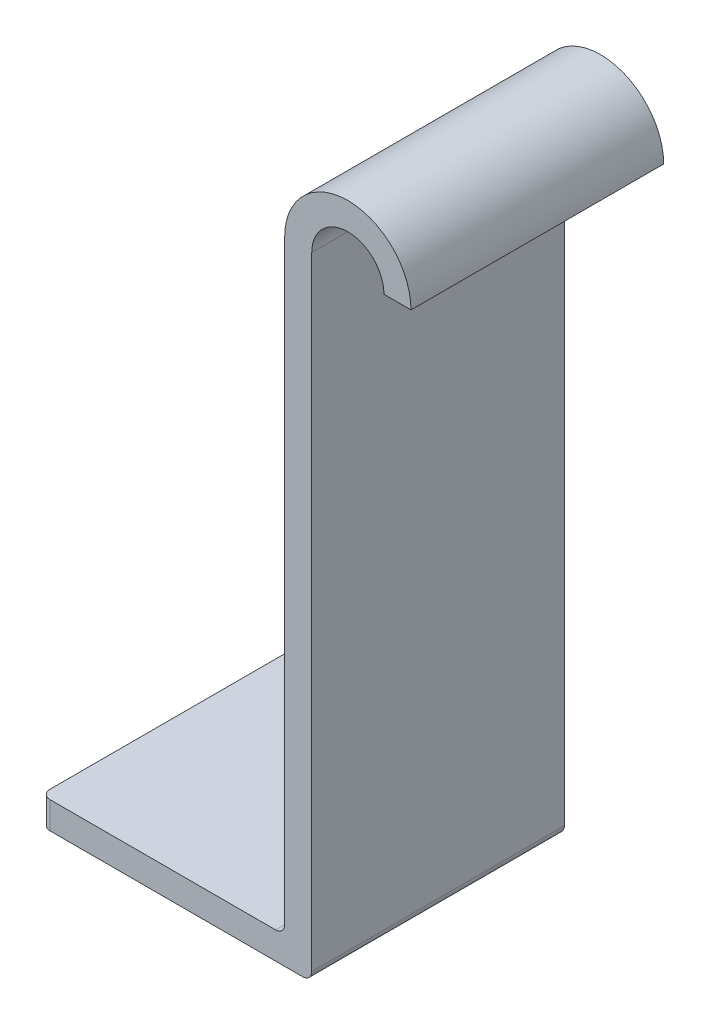
ISO-10303-21;
HEADER;
FILE_DESCRIPTION(('STEP AP214'),'2;1');
FILE_NAME('part.step','',(''),(''),'','','');
FILE_SCHEMA(('AUTOMOTIVE_DESIGN { 1 0 10303 214 1 1 1 1 }'));
ENDSEC;
DATA;
#1=APPLICATION_CONTEXT('core data for automotive mechanical design processes');
#2=APPLICATION_PROTOCOL_DEFINITION('international standard','automotive_design',2000,#1);
#3=PRODUCT_CONTEXT('',#1,'mechanical');
#4=PRODUCT('Part','Part','',(#3));
#5=PRODUCT_RELATED_PRODUCT_CATEGORY('part','',(#4));
#6=PRODUCT_DEFINITION_FORMATION('','',#4);
#7=PRODUCT_DEFINITION_CONTEXT('part definition',#1,'design');
#8=PRODUCT_DEFINITION('design','',#6,#7);
#9=PRODUCT_DEFINITION_SHAPE('','',#8);
#10=(LENGTH_UNIT() NAMED_UNIT(*) SI_UNIT(.MILLI.,.METRE.));
#11=(NAMED_UNIT(*) PLANE_ANGLE_UNIT() SI_UNIT($,.RADIAN.));
#12=(NAMED_UNIT(*) SI_UNIT($,.STERADIAN.) SOLID_ANGLE_UNIT());
#13=UNCERTAINTY_MEASURE_WITH_UNIT(LENGTH_MEASURE(1.E-05),#10,'distance_accuracy_value','');
#14=(GEOMETRIC_REPRESENTATION_CONTEXT(3) GLOBAL_UNCERTAINTY_ASSIGNED_CONTEXT((#13)) GLOBAL_UNIT_ASSIGNED_CONTEXT((#10,
#11,#12)) REPRESENTATION_CONTEXT('',''));
#15=CARTESIAN_POINT('',(0.,0.,0.));
#16=DIRECTION('',(0.,0.,1.));
#17=DIRECTION('',(1.,0.,0.));
#18=AXIS2_PLACEMENT_3D('',#15,#16,#17);
#19=CARTESIAN_POINT('',(4.,0.,28.));
#20=DIRECTION('',(0.,0.,-1.));
#21=DIRECTION('',(-1.,0.,0.));
#22=AXIS2_PLACEMENT_3D('',#19,#20,#21);
#23=CYLINDRICAL_SURFACE('',#22,4.);
#24=CARTESIAN_POINT('',(4.,0.,0.));
#25=DIRECTION('',(0.,0.,-1.));
#26=DIRECTION('',(-1.,0.,0.));
#27=AXIS2_PLACEMENT_3D('',#24,#25,#26);
#28=CIRCLE('',#27,4.);
#29=CARTESIAN_POINT('',(0.,0.,0.));
#30=VERTEX_POINT('',#29);
#31=CARTESIAN_POINT('',(8.,0.,0.));
#32=VERTEX_POINT('',#31);
#33=EDGE_CURVE('E150',#30,#32,#28,.T.);
#34=ORIENTED_EDGE('',*,*,#33,.T.);
#35=DIRECTION('',(0.,0.,-1.));
#36=VECTOR('',#35,1.);
#37=CARTESIAN_POINT('',(8.,0.,28.));
#38=LINE('',#37,#36);
#39=CARTESIAN_POINT('',(8.,0.,28.));
#40=VERTEX_POINT('',#39);
#41=EDGE_CURVE('E132',#40,#32,#38,.T.);
#42=ORIENTED_EDGE('',*,*,#41,.F.);
#43=CARTESIAN_POINT('',(4.,0.,28.));
#44=DIRECTION('',(0.,0.,-1.));
#45=DIRECTION('',(-1.,0.,0.));
#46=AXIS2_PLACEMENT_3D('',#43,#44,#45);
#47=CIRCLE('',#46,4.);
#48=CARTESIAN_POINT('',(0.,0.,28.));
#49=VERTEX_POINT('',#48);
#50=EDGE_CURVE('E138',#49,#40,#47,.T.);
#51=ORIENTED_EDGE('',*,*,#50,.F.);
#52=DIRECTION('',(0.,0.,-1.));
#53=VECTOR('',#52,1.);
#54=CARTESIAN_POINT('',(0.,0.,28.));
#55=LINE('',#54,#53);
#56=EDGE_CURVE('E217',#49,#30,#55,.T.);
#57=ORIENTED_EDGE('',*,*,#56,.T.);
#58=EDGE_LOOP('',(#34,#42,#51,#57));
#59=FACE_BOUND('',#58,.T.);
#60=ADVANCED_FACE('F37',(#59),#23,.F.);
#61=CARTESIAN_POINT('',(8.,0.,28.));
#62=DIRECTION('',(0.,1.,0.));
#63=DIRECTION('',(-1.,0.,0.));
#64=AXIS2_PLACEMENT_3D('',#61,#62,#63);
#65=PLANE('',#64);
#66=DIRECTION('',(1.,0.,0.));
#67=VECTOR('',#66,1.);
#68=CARTESIAN_POINT('',(8.,0.,0.));
#69=LINE('',#68,#67);
#70=CARTESIAN_POINT('',(11.,0.,0.));
#71=VERTEX_POINT('',#70);
#72=EDGE_CURVE('E219',#32,#71,#69,.T.);
#73=ORIENTED_EDGE('',*,*,#72,.T.);
#74=DIRECTION('',(0.,0.,-1.));
#75=VECTOR('',#74,1.);
#76=CARTESIAN_POINT('',(11.,0.,28.));
#77=LINE('',#76,#75);
#78=CARTESIAN_POINT('',(11.,0.,28.));
#79=VERTEX_POINT('',#78);
#80=EDGE_CURVE('E135',#79,#71,#77,.T.);
#81=ORIENTED_EDGE('',*,*,#80,.F.);
#82=DIRECTION('',(1.,0.,0.));
#83=VECTOR('',#82,1.);
#84=CARTESIAN_POINT('',(8.,0.,28.));
#85=LINE('',#84,#83);
#86=EDGE_CURVE('E128',#40,#79,#85,.T.);
#87=ORIENTED_EDGE('',*,*,#86,.F.);
#88=ORIENTED_EDGE('',*,*,#41,.T.);
#89=EDGE_LOOP('',(#73,#81,#87,#88));
#90=FACE_BOUND('',#89,.T.);
#91=ADVANCED_FACE('F130',(#90),#65,.F.);
#92=CARTESIAN_POINT('',(4.,0.,28.));
#93=DIRECTION('',(0.,0.,-1.));
#94=DIRECTION('',(-1.,0.,0.));
#95=AXIS2_PLACEMENT_3D('',#92,#93,#94);
#96=CYLINDRICAL_SURFACE('',#95,7.);
#97=CARTESIAN_POINT('',(4.,0.,0.));
#98=DIRECTION('',(0.,0.,1.));
#99=DIRECTION('',(-1.,0.,0.));
#100=AXIS2_PLACEMENT_3D('',#97,#98,#99);
#101=CIRCLE('',#100,7.);
#102=CARTESIAN_POINT('',(-3.,0.,0.));
#103=VERTEX_POINT('',#102);
#104=EDGE_CURVE('E199',#71,#103,#101,.T.);
#105=ORIENTED_EDGE('',*,*,#104,.T.);
#106=DIRECTION('',(0.,0.,-1.));
#107=VECTOR('',#106,1.);
#108=CARTESIAN_POINT('',(-3.,0.,28.));
#109=LINE('',#108,#107);
#110=CARTESIAN_POINT('',(-3.,0.,28.));
#111=VERTEX_POINT('',#110);
#112=EDGE_CURVE('E155',#111,#103,#109,.T.);
#113=ORIENTED_EDGE('',*,*,#112,.F.);
#114=CARTESIAN_POINT('',(4.,0.,28.));
#115=DIRECTION('',(0.,0.,1.));
#116=DIRECTION('',(-1.,0.,0.));
#117=AXIS2_PLACEMENT_3D('',#114,#115,#116);
#118=CIRCLE('',#117,7.);
#119=EDGE_CURVE('E137',#79,#111,#118,.T.);
#120=ORIENTED_EDGE('',*,*,#119,.F.);
#121=ORIENTED_EDGE('',*,*,#80,.T.);
#122=EDGE_LOOP('',(#105,#113,#120,#121));
#123=FACE_BOUND('',#122,.T.);
#124=ADVANCED_FACE('F252',(#123),#96,.T.);
#125=CARTESIAN_POINT('',(-3.,0.,28.));
#126=DIRECTION('',(1.,0.,0.));
#127=DIRECTION('',(0.,1.,0.));
#128=AXIS2_PLACEMENT_3D('',#125,#126,#127);
#129=PLANE('',#128);
#130=DIRECTION('',(0.,-1.,0.));
#131=VECTOR('',#130,1.);
#132=CARTESIAN_POINT('',(-3.,0.,0.));
#133=LINE('',#132,#131);
#134=CARTESIAN_POINT('',(-2.99999999999999,-66.,0.));
#135=VERTEX_POINT('',#134);
#136=EDGE_CURVE('E191',#103,#135,#133,.T.);
#137=ORIENTED_EDGE('',*,*,#136,.T.);
#138=DIRECTION('',(0.,0.,-1.));
#139=VECTOR('',#138,1.);
#140=CARTESIAN_POINT('',(-2.99999999999999,-66.,28.));
#141=LINE('',#140,#139);
#142=CARTESIAN_POINT('',(-2.99999999999999,-66.,28.));
#143=VERTEX_POINT('',#142);
#144=EDGE_CURVE('E60',#135,#143,#141,.F.);
#145=ORIENTED_EDGE('',*,*,#144,.T.);
#146=DIRECTION('',(0.,-1.,0.));
#147=VECTOR('',#146,1.);
#148=CARTESIAN_POINT('',(-3.,0.,28.));
#149=LINE('',#148,#147);
#150=EDGE_CURVE('E205',#111,#143,#149,.T.);
#151=ORIENTED_EDGE('',*,*,#150,.F.);
#152=ORIENTED_EDGE('',*,*,#112,.T.);
#153=EDGE_LOOP('',(#137,#145,#151,#152));
#154=FACE_BOUND('',#153,.T.);
#155=ADVANCED_FACE('F197',(#154),#129,.F.);
#156=CARTESIAN_POINT('',(-2.99999999999999,-67.,28.));
#157=DIRECTION('',(0.,-1.,0.));
#158=DIRECTION('',(0.,0.,-1.));
#159=AXIS2_PLACEMENT_3D('',#156,#157,#158);
#160=PLANE('',#159);
#161=DIRECTION('',(-1.,0.,0.));
#162=VECTOR('',#161,1.);
#163=CARTESIAN_POINT('',(-2.99999999999999,-67.,0.));
#164=LINE('',#163,#162);
#165=CARTESIAN_POINT('',(-3.99999999999999,-67.,0.));
#166=VERTEX_POINT('',#165);
#167=CARTESIAN_POINT('',(-29.,-67.,0.));
#168=VERTEX_POINT('',#167);
#169=EDGE_CURVE('E193',#166,#168,#164,.T.);
#170=ORIENTED_EDGE('',*,*,#169,.T.);
#171=CARTESIAN_POINT('',(-29.,-67.,1.));
#172=DIRECTION('',(0.,-1.,0.));
#173=DIRECTION('',(0.,0.,-1.));
#174=AXIS2_PLACEMENT_3D('',#171,#172,#173);
#175=CIRCLE('',#174,1.);
#176=CARTESIAN_POINT('',(-30.,-67.,1.));
#177=VERTEX_POINT('',#176);
#178=EDGE_CURVE('E176',#168,#177,#175,.F.);
#179=ORIENTED_EDGE('',*,*,#178,.T.);
#180=DIRECTION('',(0.,0.,-1.));
#181=VECTOR('',#180,1.);
#182=CARTESIAN_POINT('',(-30.,-67.,28.));
#183=LINE('',#182,#181);
#184=CARTESIAN_POINT('',(-30.,-67.,27.));
#185=VERTEX_POINT('',#184);
#186=EDGE_CURVE('E231',#185,#177,#183,.T.);
#187=ORIENTED_EDGE('',*,*,#186,.F.);
#188=CARTESIAN_POINT('',(-29.,-67.,27.));
#189=DIRECTION('',(0.,-1.,0.));
#190=DIRECTION('',(0.,0.,-1.));
#191=AXIS2_PLACEMENT_3D('',#188,#189,#190);
#192=CIRCLE('',#191,1.);
#193=CARTESIAN_POINT('',(-29.,-67.,28.));
#194=VERTEX_POINT('',#193);
#195=EDGE_CURVE('E174',#185,#194,#192,.F.);
#196=ORIENTED_EDGE('',*,*,#195,.T.);
#197=DIRECTION('',(-1.,0.,0.));
#198=VECTOR('',#197,1.);
#199=CARTESIAN_POINT('',(-2.99999999999999,-67.,28.));
#200=LINE('',#199,#198);
#201=CARTESIAN_POINT('',(-3.99999999999999,-67.,28.));
#202=VERTEX_POINT('',#201);
#203=EDGE_CURVE('E203',#202,#194,#200,.T.);
#204=ORIENTED_EDGE('',*,*,#203,.F.);
#205=DIRECTION('',(0.,0.,-1.));
#206=VECTOR('',#205,1.);
#207=CARTESIAN_POINT('',(-3.99999999999999,-67.,0.));
#208=LINE('',#207,#206);
#209=EDGE_CURVE('E171',#202,#166,#208,.T.);
#210=ORIENTED_EDGE('',*,*,#209,.T.);
#211=EDGE_LOOP('',(#170,#179,#187,#196,#204,#210));
#212=FACE_BOUND('',#211,.T.);
#213=ADVANCED_FACE('F207',(#212),#160,.F.);
#214=CARTESIAN_POINT('',(-30.,-70.,28.));
#215=DIRECTION('',(1.,0.,0.));
#216=DIRECTION('',(0.,0.,-1.));
#217=AXIS2_PLACEMENT_3D('',#214,#215,#216);
#218=PLANE('',#217);
#219=ORIENTED_EDGE('',*,*,#186,.T.);
#220=DIRECTION('',(0.,-1.,0.));
#221=VECTOR('',#220,1.);
#222=CARTESIAN_POINT('',(-30.,-70.,1.));
#223=LINE('',#222,#221);
#224=CARTESIAN_POINT('',(-30.,-70.,1.));
#225=VERTEX_POINT('',#224);
#226=EDGE_CURVE('E153',#177,#225,#223,.T.);
#227=ORIENTED_EDGE('',*,*,#226,.T.);
#228=DIRECTION('',(0.,0.,-1.));
#229=VECTOR('',#228,1.);
#230=CARTESIAN_POINT('',(-30.,-70.,28.));
#231=LINE('',#230,#229);
#232=CARTESIAN_POINT('',(-30.,-70.,27.));
#233=VERTEX_POINT('',#232);
#234=EDGE_CURVE('E228',#233,#225,#231,.T.);
#235=ORIENTED_EDGE('',*,*,#234,.F.);
#236=DIRECTION('',(0.,-1.,0.));
#237=VECTOR('',#236,1.);
#238=CARTESIAN_POINT('',(-30.,-70.,27.));
#239=LINE('',#238,#237);
#240=EDGE_CURVE('E151',#233,#185,#239,.F.);
#241=ORIENTED_EDGE('',*,*,#240,.T.);
#242=EDGE_LOOP('',(#219,#227,#235,#241));
#243=FACE_BOUND('',#242,.T.);
#244=ADVANCED_FACE('F235',(#243),#218,.F.);
#245=CARTESIAN_POINT('',(0.,-70.,28.));
#246=DIRECTION('',(0.,1.,0.));
#247=DIRECTION('',(0.,0.,1.));
#248=AXIS2_PLACEMENT_3D('',#245,#246,#247);
#249=PLANE('',#248);
#250=ORIENTED_EDGE('',*,*,#234,.T.);
#251=CARTESIAN_POINT('',(-29.,-70.,1.));
#252=DIRECTION('',(0.,1.,0.));
#253=DIRECTION('',(0.,0.,1.));
#254=AXIS2_PLACEMENT_3D('',#251,#252,#253);
#255=CIRCLE('',#254,1.);
#256=CARTESIAN_POINT('',(-29.,-70.,0.));
#257=VERTEX_POINT('',#256);
#258=EDGE_CURVE('E165',#225,#257,#255,.F.);
#259=ORIENTED_EDGE('',*,*,#258,.T.);
#260=DIRECTION('',(1.,0.,0.));
#261=VECTOR('',#260,1.);
#262=CARTESIAN_POINT('',(0.,-70.,0.));
#263=LINE('',#262,#261);
#264=CARTESIAN_POINT('',(-0.999999999999992,-70.,0.));
#265=VERTEX_POINT('',#264);
#266=EDGE_CURVE('E223',#257,#265,#263,.T.);
#267=ORIENTED_EDGE('',*,*,#266,.T.);
#268=DIRECTION('',(0.,0.,-1.));
#269=VECTOR('',#268,1.);
#270=CARTESIAN_POINT('',(-0.999999999999992,-70.,28.));
#271=LINE('',#270,#269);
#272=CARTESIAN_POINT('',(-0.999999999999992,-70.,28.));
#273=VERTEX_POINT('',#272);
#274=EDGE_CURVE('E161',#265,#273,#271,.F.);
#275=ORIENTED_EDGE('',*,*,#274,.T.);
#276=DIRECTION('',(1.,0.,0.));
#277=VECTOR('',#276,1.);
#278=CARTESIAN_POINT('',(0.,-70.,28.));
#279=LINE('',#278,#277);
#280=CARTESIAN_POINT('',(-29.,-70.,28.));
#281=VERTEX_POINT('',#280);
#282=EDGE_CURVE('E210',#281,#273,#279,.T.);
#283=ORIENTED_EDGE('',*,*,#282,.F.);
#284=CARTESIAN_POINT('',(-29.,-70.,27.));
#285=DIRECTION('',(0.,1.,0.));
#286=DIRECTION('',(0.,0.,1.));
#287=AXIS2_PLACEMENT_3D('',#284,#285,#286);
#288=CIRCLE('',#287,1.);
#289=EDGE_CURVE('E163',#281,#233,#288,.F.);
#290=ORIENTED_EDGE('',*,*,#289,.T.);
#291=EDGE_LOOP('',(#250,#259,#267,#275,#283,#290));
#292=FACE_BOUND('',#291,.T.);
#293=ADVANCED_FACE('F243',(#292),#249,.F.);
#294=CARTESIAN_POINT('',(0.,0.,28.));
#295=DIRECTION('',(-1.,0.,0.));
#296=DIRECTION('',(0.,-1.,0.));
#297=AXIS2_PLACEMENT_3D('',#294,#295,#296);
#298=PLANE('',#297);
#299=DIRECTION('',(0.,1.,0.));
#300=VECTOR('',#299,1.);
#301=CARTESIAN_POINT('',(0.,0.,28.));
#302=LINE('',#301,#300);
#303=CARTESIAN_POINT('',(0.,-69.,28.));
#304=VERTEX_POINT('',#303);
#305=EDGE_CURVE('E143',#304,#49,#302,.T.);
#306=ORIENTED_EDGE('',*,*,#305,.F.);
#307=DIRECTION('',(0.,0.,-1.));
#308=VECTOR('',#307,1.);
#309=CARTESIAN_POINT('',(0.,-69.,28.));
#310=LINE('',#309,#308);
#311=CARTESIAN_POINT('',(0.,-69.,0.));
#312=VERTEX_POINT('',#311);
#313=EDGE_CURVE('E182',#304,#312,#310,.T.);
#314=ORIENTED_EDGE('',*,*,#313,.T.);
#315=DIRECTION('',(0.,1.,0.));
#316=VECTOR('',#315,1.);
#317=CARTESIAN_POINT('',(0.,0.,0.));
#318=LINE('',#317,#316);
#319=EDGE_CURVE('E147',#312,#30,#318,.T.);
#320=ORIENTED_EDGE('',*,*,#319,.T.);
#321=ORIENTED_EDGE('',*,*,#56,.F.);
#322=EDGE_LOOP('',(#306,#314,#320,#321));
#323=FACE_BOUND('',#322,.T.);
#324=ADVANCED_FACE('F250',(#323),#298,.F.);
#325=CARTESIAN_POINT('',(4.,0.,28.));
#326=DIRECTION('',(0.,0.,-1.));
#327=DIRECTION('',(-1.,0.,0.));
#328=AXIS2_PLACEMENT_3D('',#325,#326,#327);
#329=PLANE('',#328);
#330=ORIENTED_EDGE('',*,*,#203,.T.);
#331=DIRECTION('',(0.,-1.,0.));
#332=VECTOR('',#331,1.);
#333=CARTESIAN_POINT('',(-29.,0.,28.));
#334=LINE('',#333,#332);
#335=EDGE_CURVE('E179',#194,#281,#334,.T.);
#336=ORIENTED_EDGE('',*,*,#335,.T.);
#337=ORIENTED_EDGE('',*,*,#282,.T.);
#338=CARTESIAN_POINT('',(-0.999999999999992,-69.,28.));
#339=DIRECTION('',(0.,0.,-1.));
#340=DIRECTION('',(-1.,0.,0.));
#341=AXIS2_PLACEMENT_3D('',#338,#339,#340);
#342=CIRCLE('',#341,1.);
#343=EDGE_CURVE('E52',#273,#304,#342,.F.);
#344=ORIENTED_EDGE('',*,*,#343,.T.);
#345=ORIENTED_EDGE('',*,*,#305,.T.);
#346=ORIENTED_EDGE('',*,*,#50,.T.);
#347=ORIENTED_EDGE('',*,*,#86,.T.);
#348=ORIENTED_EDGE('',*,*,#119,.T.);
#349=ORIENTED_EDGE('',*,*,#150,.T.);
#350=CARTESIAN_POINT('',(-3.99999999999999,-66.,28.));
#351=DIRECTION('',(0.,0.,-1.));
#352=DIRECTION('',(-1.,0.,0.));
#353=AXIS2_PLACEMENT_3D('',#350,#351,#352);
#354=CIRCLE('',#353,1.);
#355=EDGE_CURVE('E11',#143,#202,#354,.T.);
#356=ORIENTED_EDGE('',*,*,#355,.T.);
#357=EDGE_LOOP('',(#330,#336,#337,#344,#345,#346,#347,#348,#349,#356));
#358=FACE_BOUND('',#357,.T.);
#359=ADVANCED_FACE('F142',(#358),#329,.F.);
#360=CARTESIAN_POINT('',(4.,0.,0.));
#361=DIRECTION('',(0.,0.,-1.));
#362=DIRECTION('',(-1.,0.,0.));
#363=AXIS2_PLACEMENT_3D('',#360,#361,#362);
#364=PLANE('',#363);
#365=ORIENTED_EDGE('',*,*,#266,.F.);
#366=DIRECTION('',(0.,-1.,0.));
#367=VECTOR('',#366,1.);
#368=CARTESIAN_POINT('',(-29.,-67.,0.));
#369=LINE('',#368,#367);
#370=EDGE_CURVE('E169',#257,#168,#369,.F.);
#371=ORIENTED_EDGE('',*,*,#370,.T.);
#372=ORIENTED_EDGE('',*,*,#169,.F.);
#373=CARTESIAN_POINT('',(-3.99999999999999,-66.,0.));
#374=DIRECTION('',(0.,0.,-1.));
#375=DIRECTION('',(-1.,0.,0.));
#376=AXIS2_PLACEMENT_3D('',#373,#374,#375);
#377=CIRCLE('',#376,1.);
#378=EDGE_CURVE('E45',#166,#135,#377,.F.);
#379=ORIENTED_EDGE('',*,*,#378,.T.);
#380=ORIENTED_EDGE('',*,*,#136,.F.);
#381=ORIENTED_EDGE('',*,*,#104,.F.);
#382=ORIENTED_EDGE('',*,*,#72,.F.);
#383=ORIENTED_EDGE('',*,*,#33,.F.);
#384=ORIENTED_EDGE('',*,*,#319,.F.);
#385=CARTESIAN_POINT('',(-0.999999999999992,-69.,0.));
#386=DIRECTION('',(0.,0.,-1.));
#387=DIRECTION('',(-1.,0.,0.));
#388=AXIS2_PLACEMENT_3D('',#385,#386,#387);
#389=CIRCLE('',#388,1.);
#390=EDGE_CURVE('E167',#312,#265,#389,.T.);
#391=ORIENTED_EDGE('',*,*,#390,.T.);
#392=EDGE_LOOP('',(#365,#371,#372,#379,#380,#381,#382,#383,#384,#391));
#393=FACE_BOUND('',#392,.T.);
#394=ADVANCED_FACE('F189',(#393),#364,.T.);
#395=CARTESIAN_POINT('',(-29.,-70.,1.));
#396=DIRECTION('',(0.,1.,0.));
#397=DIRECTION('',(0.,0.,1.));
#398=AXIS2_PLACEMENT_3D('',#395,#396,#397);
#399=CYLINDRICAL_SURFACE('',#398,1.);
#400=ORIENTED_EDGE('',*,*,#178,.F.);
#401=ORIENTED_EDGE('',*,*,#370,.F.);
#402=ORIENTED_EDGE('',*,*,#258,.F.);
#403=ORIENTED_EDGE('',*,*,#226,.F.);
#404=EDGE_LOOP('',(#400,#401,#402,#403));
#405=FACE_BOUND('',#404,.T.);
#406=ADVANCED_FACE('F240',(#405),#399,.T.);
#407=CARTESIAN_POINT('',(-29.,0.,27.));
#408=DIRECTION('',(0.,-1.,0.));
#409=DIRECTION('',(0.,0.,-1.));
#410=AXIS2_PLACEMENT_3D('',#407,#408,#409);
#411=CYLINDRICAL_SURFACE('',#410,1.);
#412=ORIENTED_EDGE('',*,*,#195,.F.);
#413=ORIENTED_EDGE('',*,*,#240,.F.);
#414=ORIENTED_EDGE('',*,*,#289,.F.);
#415=ORIENTED_EDGE('',*,*,#335,.F.);
#416=EDGE_LOOP('',(#412,#413,#414,#415));
#417=FACE_BOUND('',#416,.T.);
#418=ADVANCED_FACE('F268',(#417),#411,.T.);
#419=CARTESIAN_POINT('',(-0.999999999999992,-69.,28.));
#420=DIRECTION('',(0.,0.,-1.));
#421=DIRECTION('',(-1.,0.,0.));
#422=AXIS2_PLACEMENT_3D('',#419,#420,#421);
#423=CYLINDRICAL_SURFACE('',#422,1.);
#424=ORIENTED_EDGE('',*,*,#343,.F.);
#425=ORIENTED_EDGE('',*,*,#274,.F.);
#426=ORIENTED_EDGE('',*,*,#390,.F.);
#427=ORIENTED_EDGE('',*,*,#313,.F.);
#428=EDGE_LOOP('',(#424,#425,#426,#427));
#429=FACE_BOUND('',#428,.T.);
#430=ADVANCED_FACE('F248',(#429),#423,.T.);
#431=CARTESIAN_POINT('',(-3.99999999999999,-66.,28.));
#432=DIRECTION('',(0.,0.,1.));
#433=DIRECTION('',(1.,0.,0.));
#434=AXIS2_PLACEMENT_3D('',#431,#432,#433);
#435=CYLINDRICAL_SURFACE('',#434,1.);
#436=ORIENTED_EDGE('',*,*,#355,.F.);
#437=ORIENTED_EDGE('',*,*,#144,.F.);
#438=ORIENTED_EDGE('',*,*,#378,.F.);
#439=ORIENTED_EDGE('',*,*,#209,.F.);
#440=EDGE_LOOP('',(#436,#437,#438,#439));
#441=FACE_BOUND('',#440,.T.);
#442=ADVANCED_FACE('F39',(#441),#435,.F.);
#443=CLOSED_SHELL('',(#60,#91,#124,#155,#213,#244,#293,#324,#359,#394,#406,#418,#430,#442));
#444=MANIFOLD_SOLID_BREP('B2',#443);
#445=ADVANCED_BREP_SHAPE_REPRESENTATION('',(#18,#444),#14);
#446=SHAPE_DEFINITION_REPRESENTATION(#9,#445);
ENDSEC;
END-ISO-10303-21;
